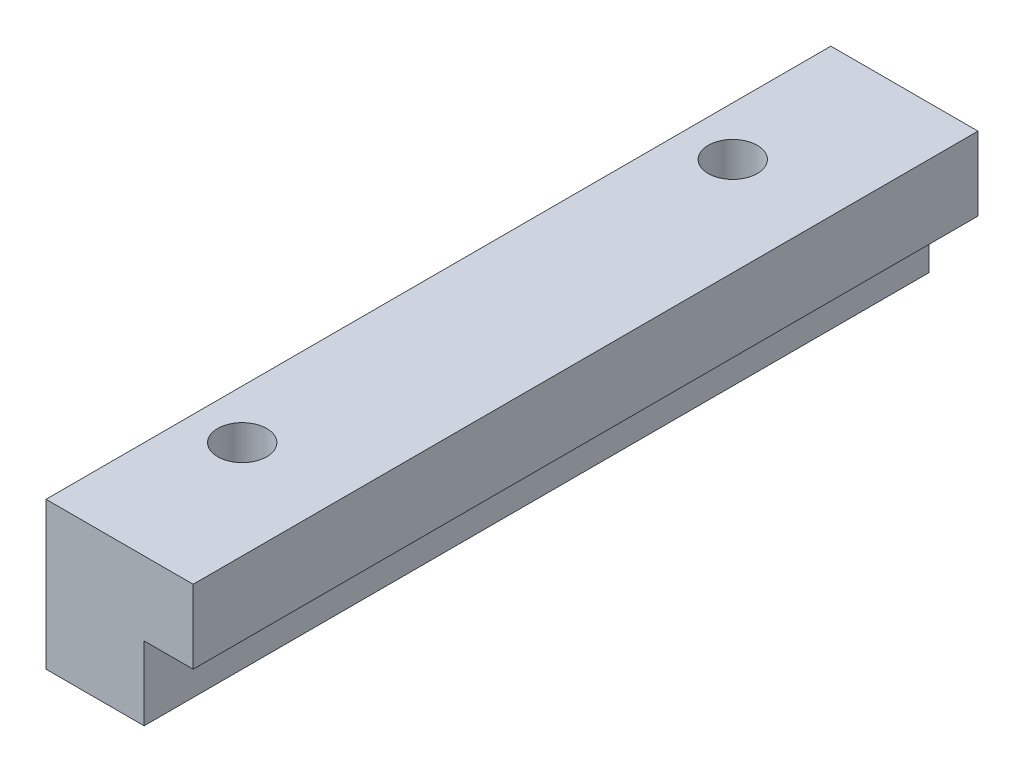
ISO-10303-21;
HEADER;
FILE_DESCRIPTION(('STEP AP214'),'2;1');
FILE_NAME('part.step','',(''),(''),'','','');
FILE_SCHEMA(('AUTOMOTIVE_DESIGN { 1 0 10303 214 1 1 1 1 }'));
ENDSEC;
DATA;
#1=APPLICATION_CONTEXT('core data for automotive mechanical design processes');
#2=APPLICATION_PROTOCOL_DEFINITION('international standard','automotive_design',2000,#1);
#3=PRODUCT_CONTEXT('',#1,'mechanical');
#4=PRODUCT('Part','Part','',(#3));
#5=PRODUCT_RELATED_PRODUCT_CATEGORY('part','',(#4));
#6=PRODUCT_DEFINITION_FORMATION('','',#4);
#7=PRODUCT_DEFINITION_CONTEXT('part definition',#1,'design');
#8=PRODUCT_DEFINITION('design','',#6,#7);
#9=PRODUCT_DEFINITION_SHAPE('','',#8);
#10=(LENGTH_UNIT() NAMED_UNIT(*) SI_UNIT(.MILLI.,.METRE.));
#11=(NAMED_UNIT(*) PLANE_ANGLE_UNIT() SI_UNIT($,.RADIAN.));
#12=(NAMED_UNIT(*) SI_UNIT($,.STERADIAN.) SOLID_ANGLE_UNIT());
#13=UNCERTAINTY_MEASURE_WITH_UNIT(LENGTH_MEASURE(1.E-05),#10,'distance_accuracy_value','');
#14=(GEOMETRIC_REPRESENTATION_CONTEXT(3) GLOBAL_UNCERTAINTY_ASSIGNED_CONTEXT((#13)) GLOBAL_UNIT_ASSIGNED_CONTEXT((#10,
#11,#12)) REPRESENTATION_CONTEXT('',''));
#15=CARTESIAN_POINT('',(0.,0.,0.));
#16=DIRECTION('',(0.,0.,1.));
#17=DIRECTION('',(1.,0.,0.));
#18=AXIS2_PLACEMENT_3D('',#15,#16,#17);
#19=CARTESIAN_POINT('',(-9.525,9.525,50.8));
#20=DIRECTION('',(0.,0.,-1.));
#21=DIRECTION('',(-1.,0.,0.));
#22=AXIS2_PLACEMENT_3D('',#19,#20,#21);
#23=PLANE('',#22);
#24=DIRECTION('',(1.,0.,0.));
#25=VECTOR('',#24,1.);
#26=CARTESIAN_POINT('',(-9.525,-9.525,50.8));
#27=LINE('',#26,#25);
#28=CARTESIAN_POINT('',(-9.525,-9.525,50.8));
#29=VERTEX_POINT('',#28);
#30=CARTESIAN_POINT('',(3.175,-9.525,50.8));
#31=VERTEX_POINT('',#30);
#32=EDGE_CURVE('E140',#29,#31,#27,.T.);
#33=ORIENTED_EDGE('',*,*,#32,.T.);
#34=DIRECTION('',(0.,-1.,0.));
#35=VECTOR('',#34,1.);
#36=CARTESIAN_POINT('',(3.175,0.,50.8));
#37=LINE('',#36,#35);
#38=CARTESIAN_POINT('',(3.175,0.,50.8));
#39=VERTEX_POINT('',#38);
#40=EDGE_CURVE('E55',#39,#31,#37,.T.);
#41=ORIENTED_EDGE('',*,*,#40,.F.);
#42=DIRECTION('',(-1.,0.,0.));
#43=VECTOR('',#42,1.);
#44=CARTESIAN_POINT('',(3.175,0.,50.8));
#45=LINE('',#44,#43);
#46=CARTESIAN_POINT('',(9.525,0.,50.8));
#47=VERTEX_POINT('',#46);
#48=EDGE_CURVE('E158',#47,#39,#45,.T.);
#49=ORIENTED_EDGE('',*,*,#48,.F.);
#50=DIRECTION('',(0.,-1.,0.));
#51=VECTOR('',#50,1.);
#52=CARTESIAN_POINT('',(9.525,9.525,50.8));
#53=LINE('',#52,#51);
#54=CARTESIAN_POINT('',(9.525,9.525,50.8));
#55=VERTEX_POINT('',#54);
#56=EDGE_CURVE('E11',#55,#47,#53,.T.);
#57=ORIENTED_EDGE('',*,*,#56,.F.);
#58=DIRECTION('',(1.,0.,0.));
#59=VECTOR('',#58,1.);
#60=CARTESIAN_POINT('',(-9.525,9.525,50.8));
#61=LINE('',#60,#59);
#62=CARTESIAN_POINT('',(-9.525,9.525,50.8));
#63=VERTEX_POINT('',#62);
#64=EDGE_CURVE('E135',#63,#55,#61,.T.);
#65=ORIENTED_EDGE('',*,*,#64,.F.);
#66=DIRECTION('',(0.,-1.,0.));
#67=VECTOR('',#66,1.);
#68=CARTESIAN_POINT('',(-9.525,9.525,50.8));
#69=LINE('',#68,#67);
#70=EDGE_CURVE('E64',#63,#29,#69,.T.);
#71=ORIENTED_EDGE('',*,*,#70,.T.);
#72=EDGE_LOOP('',(#33,#41,#49,#57,#65,#71));
#73=FACE_BOUND('',#72,.T.);
#74=ADVANCED_FACE('F39',(#73),#23,.F.);
#75=CARTESIAN_POINT('',(9.525,9.525,50.8));
#76=DIRECTION('',(-1.,0.,0.));
#77=DIRECTION('',(0.,0.,1.));
#78=AXIS2_PLACEMENT_3D('',#75,#76,#77);
#79=PLANE('',#78);
#80=ORIENTED_EDGE('',*,*,#56,.T.);
#81=DIRECTION('',(0.,0.,1.));
#82=VECTOR('',#81,1.);
#83=CARTESIAN_POINT('',(9.525,0.,-50.8));
#84=LINE('',#83,#82);
#85=CARTESIAN_POINT('',(9.525,0.,-50.8));
#86=VERTEX_POINT('',#85);
#87=EDGE_CURVE('E104',#86,#47,#84,.T.);
#88=ORIENTED_EDGE('',*,*,#87,.F.);
#89=DIRECTION('',(0.,-1.,0.));
#90=VECTOR('',#89,1.);
#91=CARTESIAN_POINT('',(9.525,9.525,-50.8));
#92=LINE('',#91,#90);
#93=CARTESIAN_POINT('',(9.525,9.525,-50.8));
#94=VERTEX_POINT('',#93);
#95=EDGE_CURVE('E48',#94,#86,#92,.T.);
#96=ORIENTED_EDGE('',*,*,#95,.F.);
#97=DIRECTION('',(0.,0.,-1.));
#98=VECTOR('',#97,1.);
#99=CARTESIAN_POINT('',(9.525,9.525,50.8));
#100=LINE('',#99,#98);
#101=EDGE_CURVE('E84',#55,#94,#100,.T.);
#102=ORIENTED_EDGE('',*,*,#101,.F.);
#103=EDGE_LOOP('',(#80,#88,#96,#102));
#104=FACE_BOUND('',#103,.T.);
#105=ADVANCED_FACE('F114',(#104),#79,.F.);
#106=CARTESIAN_POINT('',(-9.525,9.525,-50.8));
#107=DIRECTION('',(0.,0.,-1.));
#108=DIRECTION('',(-1.,0.,0.));
#109=AXIS2_PLACEMENT_3D('',#106,#107,#108);
#110=PLANE('',#109);
#111=DIRECTION('',(0.,-1.,0.));
#112=VECTOR('',#111,1.);
#113=CARTESIAN_POINT('',(3.175,0.,-50.8));
#114=LINE('',#113,#112);
#115=CARTESIAN_POINT('',(3.175,0.,-50.8));
#116=VERTEX_POINT('',#115);
#117=CARTESIAN_POINT('',(3.175,-9.525,-50.8));
#118=VERTEX_POINT('',#117);
#119=EDGE_CURVE('E112',#116,#118,#114,.T.);
#120=ORIENTED_EDGE('',*,*,#119,.T.);
#121=DIRECTION('',(1.,0.,0.));
#122=VECTOR('',#121,1.);
#123=CARTESIAN_POINT('',(-9.525,-9.525,-50.8));
#124=LINE('',#123,#122);
#125=CARTESIAN_POINT('',(-9.525,-9.525,-50.8));
#126=VERTEX_POINT('',#125);
#127=EDGE_CURVE('E136',#126,#118,#124,.T.);
#128=ORIENTED_EDGE('',*,*,#127,.F.);
#129=DIRECTION('',(0.,-1.,0.));
#130=VECTOR('',#129,1.);
#131=CARTESIAN_POINT('',(-9.525,9.525,-50.8));
#132=LINE('',#131,#130);
#133=CARTESIAN_POINT('',(-9.525,9.525,-50.8));
#134=VERTEX_POINT('',#133);
#135=EDGE_CURVE('E123',#134,#126,#132,.T.);
#136=ORIENTED_EDGE('',*,*,#135,.F.);
#137=DIRECTION('',(1.,0.,0.));
#138=VECTOR('',#137,1.);
#139=CARTESIAN_POINT('',(-9.525,9.525,-50.8));
#140=LINE('',#139,#138);
#141=EDGE_CURVE('E121',#134,#94,#140,.T.);
#142=ORIENTED_EDGE('',*,*,#141,.T.);
#143=ORIENTED_EDGE('',*,*,#95,.T.);
#144=DIRECTION('',(-1.,0.,0.));
#145=VECTOR('',#144,1.);
#146=CARTESIAN_POINT('',(3.175,0.,-50.8));
#147=LINE('',#146,#145);
#148=EDGE_CURVE('E100',#86,#116,#147,.T.);
#149=ORIENTED_EDGE('',*,*,#148,.T.);
#150=EDGE_LOOP('',(#120,#128,#136,#142,#143,#149));
#151=FACE_BOUND('',#150,.T.);
#152=ADVANCED_FACE('F119',(#151),#110,.T.);
#153=CARTESIAN_POINT('',(-9.525,9.525,50.8));
#154=DIRECTION('',(-1.,0.,0.));
#155=DIRECTION('',(0.,0.,1.));
#156=AXIS2_PLACEMENT_3D('',#153,#154,#155);
#157=PLANE('',#156);
#158=DIRECTION('',(0.,0.,-1.));
#159=VECTOR('',#158,1.);
#160=CARTESIAN_POINT('',(-9.525,-9.525,50.8));
#161=LINE('',#160,#159);
#162=EDGE_CURVE('E131',#29,#126,#161,.T.);
#163=ORIENTED_EDGE('',*,*,#162,.F.);
#164=ORIENTED_EDGE('',*,*,#70,.F.);
#165=DIRECTION('',(0.,0.,-1.));
#166=VECTOR('',#165,1.);
#167=CARTESIAN_POINT('',(-9.525,9.525,50.8));
#168=LINE('',#167,#166);
#169=EDGE_CURVE('E130',#63,#134,#168,.T.);
#170=ORIENTED_EDGE('',*,*,#169,.T.);
#171=ORIENTED_EDGE('',*,*,#135,.T.);
#172=EDGE_LOOP('',(#163,#164,#170,#171));
#173=FACE_BOUND('',#172,.T.);
#174=ADVANCED_FACE('F183',(#173),#157,.T.);
#175=CARTESIAN_POINT('',(0.,9.525,0.));
#176=DIRECTION('',(0.,1.,0.));
#177=DIRECTION('',(0.,0.,1.));
#178=AXIS2_PLACEMENT_3D('',#175,#176,#177);
#179=PLANE('',#178);
#180=CARTESIAN_POINT('',(-3.175,9.525,-31.75));
#181=DIRECTION('',(0.,1.,0.));
#182=DIRECTION('',(0.,0.,1.));
#183=AXIS2_PLACEMENT_3D('',#180,#181,#182);
#184=CIRCLE('',#183,3.175);
#185=CARTESIAN_POINT('',(-3.175,9.525,-28.575));
#186=VERTEX_POINT('',#185);
#187=EDGE_CURVE('E171',#186,#186,#184,.T.);
#188=ORIENTED_EDGE('',*,*,#187,.F.);
#189=EDGE_LOOP('',(#188));
#190=FACE_BOUND('',#189,.T.);
#191=CARTESIAN_POINT('',(-3.175,9.525,31.75));
#192=DIRECTION('',(0.,1.,0.));
#193=DIRECTION('',(0.,0.,1.));
#194=AXIS2_PLACEMENT_3D('',#191,#192,#193);
#195=CIRCLE('',#194,3.175);
#196=CARTESIAN_POINT('',(-3.175,9.525,34.925));
#197=VERTEX_POINT('',#196);
#198=EDGE_CURVE('E163',#197,#197,#195,.T.);
#199=ORIENTED_EDGE('',*,*,#198,.F.);
#200=EDGE_LOOP('',(#199));
#201=FACE_BOUND('',#200,.T.);
#202=ORIENTED_EDGE('',*,*,#64,.T.);
#203=ORIENTED_EDGE('',*,*,#101,.T.);
#204=ORIENTED_EDGE('',*,*,#141,.F.);
#205=ORIENTED_EDGE('',*,*,#169,.F.);
#206=EDGE_LOOP('',(#202,#203,#204,#205));
#207=FACE_BOUND('',#206,.T.);
#208=ADVANCED_FACE('F179',(#190,#201,#207),#179,.T.);
#209=CARTESIAN_POINT('',(0.,-9.525,0.));
#210=DIRECTION('',(0.,1.,0.));
#211=DIRECTION('',(0.,0.,1.));
#212=AXIS2_PLACEMENT_3D('',#209,#210,#211);
#213=PLANE('',#212);
#214=CARTESIAN_POINT('',(-3.175,-9.525,-31.75));
#215=DIRECTION('',(0.,1.,0.));
#216=DIRECTION('',(0.,0.,1.));
#217=AXIS2_PLACEMENT_3D('',#214,#215,#216);
#218=CIRCLE('',#217,3.175);
#219=CARTESIAN_POINT('',(-3.175,-9.525,-28.575));
#220=VERTEX_POINT('',#219);
#221=EDGE_CURVE('E167',#220,#220,#218,.T.);
#222=ORIENTED_EDGE('',*,*,#221,.T.);
#223=EDGE_LOOP('',(#222));
#224=FACE_BOUND('',#223,.T.);
#225=CARTESIAN_POINT('',(-3.175,-9.525,31.75));
#226=DIRECTION('',(0.,1.,0.));
#227=DIRECTION('',(0.,0.,1.));
#228=AXIS2_PLACEMENT_3D('',#225,#226,#227);
#229=CIRCLE('',#228,3.175);
#230=CARTESIAN_POINT('',(-3.175,-9.525,34.925));
#231=VERTEX_POINT('',#230);
#232=EDGE_CURVE('E42',#231,#231,#229,.T.);
#233=ORIENTED_EDGE('',*,*,#232,.T.);
#234=EDGE_LOOP('',(#233));
#235=FACE_BOUND('',#234,.T.);
#236=ORIENTED_EDGE('',*,*,#127,.T.);
#237=DIRECTION('',(0.,0.,1.));
#238=VECTOR('',#237,1.);
#239=CARTESIAN_POINT('',(3.175,-9.525,-50.8));
#240=LINE('',#239,#238);
#241=EDGE_CURVE('E143',#118,#31,#240,.T.);
#242=ORIENTED_EDGE('',*,*,#241,.T.);
#243=ORIENTED_EDGE('',*,*,#32,.F.);
#244=ORIENTED_EDGE('',*,*,#162,.T.);
#245=EDGE_LOOP('',(#236,#242,#243,#244));
#246=FACE_BOUND('',#245,.T.);
#247=ADVANCED_FACE('F182',(#224,#235,#246),#213,.F.);
#248=CARTESIAN_POINT('',(3.175,0.,-50.8));
#249=DIRECTION('',(-1.,0.,0.));
#250=DIRECTION('',(0.,-1.,0.));
#251=AXIS2_PLACEMENT_3D('',#248,#249,#250);
#252=PLANE('',#251);
#253=ORIENTED_EDGE('',*,*,#40,.T.);
#254=ORIENTED_EDGE('',*,*,#241,.F.);
#255=ORIENTED_EDGE('',*,*,#119,.F.);
#256=DIRECTION('',(0.,0.,1.));
#257=VECTOR('',#256,1.);
#258=CARTESIAN_POINT('',(3.175,0.,-50.8));
#259=LINE('',#258,#257);
#260=EDGE_CURVE('E106',#116,#39,#259,.T.);
#261=ORIENTED_EDGE('',*,*,#260,.T.);
#262=EDGE_LOOP('',(#253,#254,#255,#261));
#263=FACE_BOUND('',#262,.T.);
#264=ADVANCED_FACE('F190',(#263),#252,.F.);
#265=CARTESIAN_POINT('',(3.175,0.,-50.8));
#266=DIRECTION('',(0.,1.,0.));
#267=DIRECTION('',(-1.,0.,0.));
#268=AXIS2_PLACEMENT_3D('',#265,#266,#267);
#269=PLANE('',#268);
#270=ORIENTED_EDGE('',*,*,#48,.T.);
#271=ORIENTED_EDGE('',*,*,#260,.F.);
#272=ORIENTED_EDGE('',*,*,#148,.F.);
#273=ORIENTED_EDGE('',*,*,#87,.T.);
#274=EDGE_LOOP('',(#270,#271,#272,#273));
#275=FACE_BOUND('',#274,.T.);
#276=ADVANCED_FACE('F103',(#275),#269,.F.);
#277=CARTESIAN_POINT('',(-3.175,9.525,31.75));
#278=DIRECTION('',(0.,1.,0.));
#279=DIRECTION('',(0.,0.,1.));
#280=AXIS2_PLACEMENT_3D('',#277,#278,#279);
#281=CYLINDRICAL_SURFACE('',#280,3.175);
#282=ORIENTED_EDGE('',*,*,#198,.T.);
#283=EDGE_LOOP('',(#282));
#284=FACE_BOUND('',#283,.T.);
#285=ORIENTED_EDGE('',*,*,#232,.F.);
#286=EDGE_LOOP('',(#285));
#287=FACE_BOUND('',#286,.T.);
#288=ADVANCED_FACE('F197',(#284,#287),#281,.F.);
#289=CARTESIAN_POINT('',(-3.175,9.525,-31.75));
#290=DIRECTION('',(0.,1.,0.));
#291=DIRECTION('',(0.,0.,1.));
#292=AXIS2_PLACEMENT_3D('',#289,#290,#291);
#293=CYLINDRICAL_SURFACE('',#292,3.175);
#294=ORIENTED_EDGE('',*,*,#187,.T.);
#295=EDGE_LOOP('',(#294));
#296=FACE_BOUND('',#295,.T.);
#297=ORIENTED_EDGE('',*,*,#221,.F.);
#298=EDGE_LOOP('',(#297));
#299=FACE_BOUND('',#298,.T.);
#300=ADVANCED_FACE('F176',(#296,#299),#293,.F.);
#301=CLOSED_SHELL('',(#74,#105,#152,#174,#208,#247,#264,#276,#288,#300));
#302=MANIFOLD_SOLID_BREP('B2',#301);
#303=ADVANCED_BREP_SHAPE_REPRESENTATION('',(#18,#302),#14);
#304=SHAPE_DEFINITION_REPRESENTATION(#9,#303);
ENDSEC;
END-ISO-10303-21;
